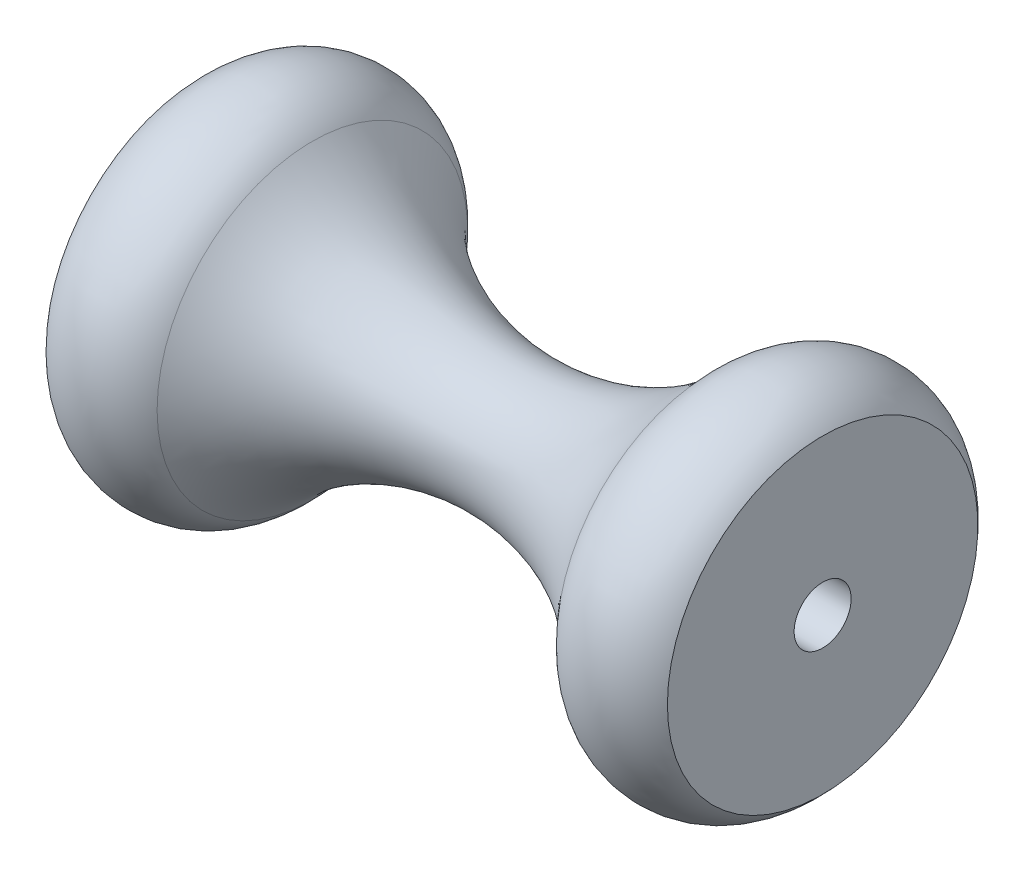
ISO-10303-21;
HEADER;
FILE_DESCRIPTION(('STEP AP214'),'2;1');
FILE_NAME('part.step','',(''),(''),'','','');
FILE_SCHEMA(('AUTOMOTIVE_DESIGN { 1 0 10303 214 1 1 1 1 }'));
ENDSEC;
DATA;
#1=APPLICATION_CONTEXT('core data for automotive mechanical design processes');
#2=APPLICATION_PROTOCOL_DEFINITION('international standard','automotive_design',2000,#1);
#3=PRODUCT_CONTEXT('',#1,'mechanical');
#4=PRODUCT('Part','Part','',(#3));
#5=PRODUCT_RELATED_PRODUCT_CATEGORY('part','',(#4));
#6=PRODUCT_DEFINITION_FORMATION('','',#4);
#7=PRODUCT_DEFINITION_CONTEXT('part definition',#1,'design');
#8=PRODUCT_DEFINITION('design','',#6,#7);
#9=PRODUCT_DEFINITION_SHAPE('','',#8);
#10=(LENGTH_UNIT() NAMED_UNIT(*) SI_UNIT(.MILLI.,.METRE.));
#11=(NAMED_UNIT(*) PLANE_ANGLE_UNIT() SI_UNIT($,.RADIAN.));
#12=(NAMED_UNIT(*) SI_UNIT($,.STERADIAN.) SOLID_ANGLE_UNIT());
#13=UNCERTAINTY_MEASURE_WITH_UNIT(LENGTH_MEASURE(1.E-05),#10,'distance_accuracy_value','');
#14=(GEOMETRIC_REPRESENTATION_CONTEXT(3) GLOBAL_UNCERTAINTY_ASSIGNED_CONTEXT((#13)) GLOBAL_UNIT_ASSIGNED_CONTEXT((#10,
#11,#12)) REPRESENTATION_CONTEXT('',''));
#15=CARTESIAN_POINT('',(0.,0.,0.));
#16=DIRECTION('',(0.,0.,1.));
#17=DIRECTION('',(1.,0.,0.));
#18=AXIS2_PLACEMENT_3D('',#15,#16,#17);
#19=CARTESIAN_POINT('',(-25.,0.,0.));
#20=DIRECTION('',(-1.,0.,0.));
#21=DIRECTION('',(0.,0.,1.));
#22=AXIS2_PLACEMENT_3D('',#19,#20,#21);
#23=PLANE('',#22);
#24=CARTESIAN_POINT('',(-25.,0.,0.));
#25=DIRECTION('',(1.,0.,0.));
#26=DIRECTION('',(0.,0.,-1.));
#27=AXIS2_PLACEMENT_3D('',#24,#25,#26);
#28=CIRCLE('',#27,2.29412753246923);
#29=CARTESIAN_POINT('',(-25.,0.,-2.29412753246923));
#30=VERTEX_POINT('',#29);
#31=EDGE_CURVE('E53',#30,#30,#28,.T.);
#32=ORIENTED_EDGE('',*,*,#31,.T.);
#33=EDGE_LOOP('',(#32));
#34=FACE_BOUND('',#33,.T.);
#35=CARTESIAN_POINT('',(-25.,0.,0.));
#36=DIRECTION('',(-1.,0.,0.));
#37=DIRECTION('',(0.,0.,1.));
#38=AXIS2_PLACEMENT_3D('',#35,#36,#37);
#39=CIRCLE('',#38,12.5);
#40=CARTESIAN_POINT('',(-25.,0.,12.5));
#41=VERTEX_POINT('',#40);
#42=EDGE_CURVE('E10',#41,#41,#39,.T.);
#43=ORIENTED_EDGE('',*,*,#42,.T.);
#44=EDGE_LOOP('',(#43));
#45=FACE_BOUND('',#44,.T.);
#46=ADVANCED_FACE('F34',(#34,#45),#23,.T.);
#47=CARTESIAN_POINT('',(-20.5428539710727,0.,0.));
#48=DIRECTION('',(-1.,0.,0.));
#49=DIRECTION('',(0.,0.,1.));
#50=AXIS2_PLACEMENT_3D('',#47,#48,#49);
#51=TOROIDAL_SURFACE('',#50,8.75932090729648,5.81883414420549);
#52=CARTESIAN_POINT('',(-16.0857079421454,0.,0.));
#53=DIRECTION('',(-1.,0.,0.));
#54=DIRECTION('',(0.,0.,1.));
#55=AXIS2_PLACEMENT_3D('',#52,#53,#54);
#56=CIRCLE('',#55,12.5);
#57=CARTESIAN_POINT('',(-16.0857079421454,0.,12.5));
#58=VERTEX_POINT('',#57);
#59=EDGE_CURVE('E40',#58,#58,#56,.T.);
#60=ORIENTED_EDGE('',*,*,#59,.T.);
#61=EDGE_LOOP('',(#60));
#62=FACE_BOUND('',#61,.T.);
#63=ORIENTED_EDGE('',*,*,#42,.F.);
#64=EDGE_LOOP('',(#63));
#65=FACE_BOUND('',#64,.T.);
#66=ADVANCED_FACE('F82',(#62,#65),#51,.T.);
#67=CARTESIAN_POINT('',(0.,0.,0.));
#68=DIRECTION('',(-1.,0.,0.));
#69=DIRECTION('',(0.,0.,1.));
#70=AXIS2_PLACEMENT_3D('',#67,#68,#69);
#71=TOROIDAL_SURFACE('',#70,26.,21.);
#72=CARTESIAN_POINT('',(16.0857079421454,0.,0.));
#73=DIRECTION('',(-1.,0.,0.));
#74=DIRECTION('',(0.,0.,1.));
#75=AXIS2_PLACEMENT_3D('',#72,#73,#74);
#76=CIRCLE('',#75,12.5);
#77=CARTESIAN_POINT('',(16.0857079421454,0.,12.5));
#78=VERTEX_POINT('',#77);
#79=EDGE_CURVE('E44',#78,#78,#76,.T.);
#80=ORIENTED_EDGE('',*,*,#79,.T.);
#81=EDGE_LOOP('',(#80));
#82=FACE_BOUND('',#81,.T.);
#83=ORIENTED_EDGE('',*,*,#59,.F.);
#84=EDGE_LOOP('',(#83));
#85=FACE_BOUND('',#84,.T.);
#86=ADVANCED_FACE('F76',(#82,#85),#71,.F.);
#87=CARTESIAN_POINT('',(20.5428539710727,0.,0.));
#88=DIRECTION('',(-1.,0.,0.));
#89=DIRECTION('',(0.,0.,1.));
#90=AXIS2_PLACEMENT_3D('',#87,#88,#89);
#91=TOROIDAL_SURFACE('',#90,8.75932090729648,5.81883414420549);
#92=CARTESIAN_POINT('',(25.,0.,0.));
#93=DIRECTION('',(-1.,0.,0.));
#94=DIRECTION('',(0.,0.,1.));
#95=AXIS2_PLACEMENT_3D('',#92,#93,#94);
#96=CIRCLE('',#95,12.5);
#97=CARTESIAN_POINT('',(25.,0.,12.5));
#98=VERTEX_POINT('',#97);
#99=EDGE_CURVE('E48',#98,#98,#96,.T.);
#100=ORIENTED_EDGE('',*,*,#99,.T.);
#101=EDGE_LOOP('',(#100));
#102=FACE_BOUND('',#101,.T.);
#103=ORIENTED_EDGE('',*,*,#79,.F.);
#104=EDGE_LOOP('',(#103));
#105=FACE_BOUND('',#104,.T.);
#106=ADVANCED_FACE('F70',(#102,#105),#91,.T.);
#107=CARTESIAN_POINT('',(25.,0.,0.));
#108=DIRECTION('',(1.,0.,0.));
#109=DIRECTION('',(0.,0.,-1.));
#110=AXIS2_PLACEMENT_3D('',#107,#108,#109);
#111=PLANE('',#110);
#112=CARTESIAN_POINT('',(25.,0.,0.));
#113=DIRECTION('',(1.,0.,0.));
#114=DIRECTION('',(0.,0.,-1.));
#115=AXIS2_PLACEMENT_3D('',#112,#113,#114);
#116=CIRCLE('',#115,2.29412753246923);
#117=CARTESIAN_POINT('',(25.,0.,-2.29412753246923));
#118=VERTEX_POINT('',#117);
#119=EDGE_CURVE('E54',#118,#118,#116,.T.);
#120=ORIENTED_EDGE('',*,*,#119,.F.);
#121=EDGE_LOOP('',(#120));
#122=FACE_BOUND('',#121,.T.);
#123=ORIENTED_EDGE('',*,*,#99,.F.);
#124=EDGE_LOOP('',(#123));
#125=FACE_BOUND('',#124,.T.);
#126=ADVANCED_FACE('F64',(#122,#125),#111,.T.);
#127=CARTESIAN_POINT('',(-25.,0.,0.));
#128=DIRECTION('',(1.,0.,0.));
#129=DIRECTION('',(0.,0.,-1.));
#130=AXIS2_PLACEMENT_3D('',#127,#128,#129);
#131=CYLINDRICAL_SURFACE('',#130,2.29412753246923);
#132=ORIENTED_EDGE('',*,*,#31,.F.);
#133=EDGE_LOOP('',(#132));
#134=FACE_BOUND('',#133,.T.);
#135=ORIENTED_EDGE('',*,*,#119,.T.);
#136=EDGE_LOOP('',(#135));
#137=FACE_BOUND('',#136,.T.);
#138=ADVANCED_FACE('F61',(#134,#137),#131,.F.);
#139=CLOSED_SHELL('',(#46,#66,#86,#106,#126,#138));
#140=MANIFOLD_SOLID_BREP('B2',#139);
#141=ADVANCED_BREP_SHAPE_REPRESENTATION('',(#18,#140),#14);
#142=SHAPE_DEFINITION_REPRESENTATION(#9,#141);
ENDSEC;
END-ISO-10303-21;
